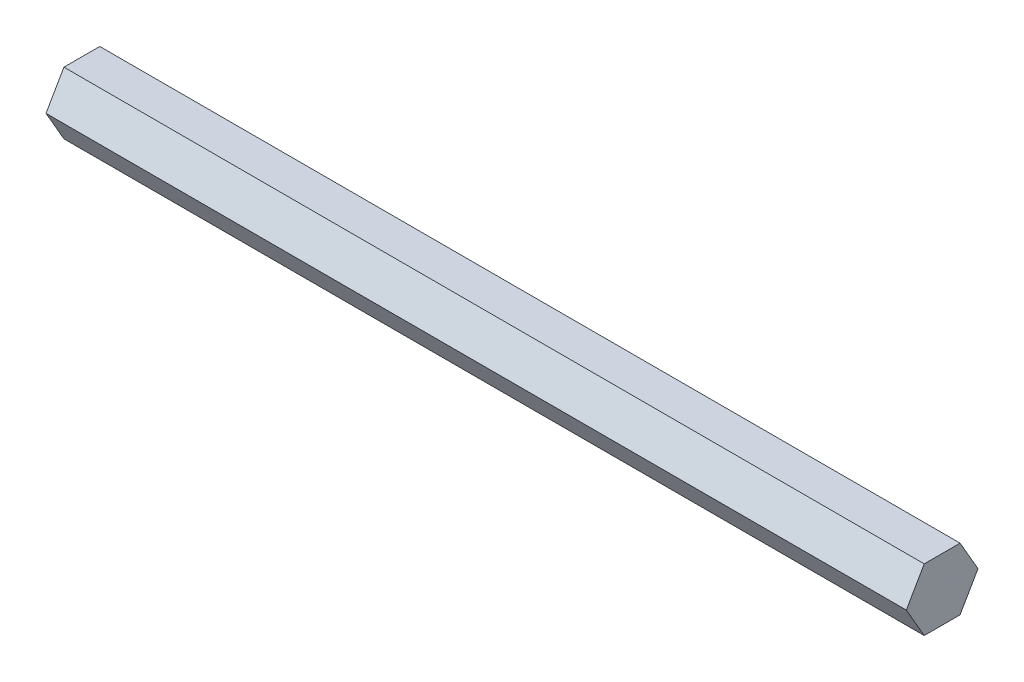
ISO-10303-21;
HEADER;
FILE_DESCRIPTION(('STEP AP214'),'2;1');
FILE_NAME('part.step','',(''),(''),'','','');
FILE_SCHEMA(('AUTOMOTIVE_DESIGN { 1 0 10303 214 1 1 1 1 }'));
ENDSEC;
DATA;
#1=APPLICATION_CONTEXT('core data for automotive mechanical design processes');
#2=APPLICATION_PROTOCOL_DEFINITION('international standard','automotive_design',2000,#1);
#3=PRODUCT_CONTEXT('',#1,'mechanical');
#4=PRODUCT('Part','Part','',(#3));
#5=PRODUCT_RELATED_PRODUCT_CATEGORY('part','',(#4));
#6=PRODUCT_DEFINITION_FORMATION('','',#4);
#7=PRODUCT_DEFINITION_CONTEXT('part definition',#1,'design');
#8=PRODUCT_DEFINITION('design','',#6,#7);
#9=PRODUCT_DEFINITION_SHAPE('','',#8);
#10=(LENGTH_UNIT() NAMED_UNIT(*) SI_UNIT(.MILLI.,.METRE.));
#11=(NAMED_UNIT(*) PLANE_ANGLE_UNIT() SI_UNIT($,.RADIAN.));
#12=(NAMED_UNIT(*) SI_UNIT($,.STERADIAN.) SOLID_ANGLE_UNIT());
#13=UNCERTAINTY_MEASURE_WITH_UNIT(LENGTH_MEASURE(1.E-05),#10,'distance_accuracy_value','');
#14=(GEOMETRIC_REPRESENTATION_CONTEXT(3) GLOBAL_UNCERTAINTY_ASSIGNED_CONTEXT((#13)) GLOBAL_UNIT_ASSIGNED_CONTEXT((#10,
#11,#12)) REPRESENTATION_CONTEXT('',''));
#15=CARTESIAN_POINT('',(0.,0.,0.));
#16=DIRECTION('',(0.,0.,1.));
#17=DIRECTION('',(1.,0.,0.));
#18=AXIS2_PLACEMENT_3D('',#15,#16,#17);
#19=CARTESIAN_POINT('',(114.3,-4.12444598552336,-2.38125000000005));
#20=DIRECTION('',(0.,0.499999999999995,0.866025403784442));
#21=DIRECTION('',(0.,-0.866025403784442,0.499999999999995));
#22=AXIS2_PLACEMENT_3D('',#19,#20,#21);
#23=PLANE('',#22);
#24=DIRECTION('',(0.,0.866025403784442,-0.499999999999995));
#25=VECTOR('',#24,1.);
#26=CARTESIAN_POINT('',(0.,-4.12444598552336,-2.38125000000005));
#27=LINE('',#26,#25);
#28=CARTESIAN_POINT('',(0.,-4.12444598552336,-2.38125000000005));
#29=VERTEX_POINT('',#28);
#30=CARTESIAN_POINT('',(0.,0.,-4.7625));
#31=VERTEX_POINT('',#30);
#32=EDGE_CURVE('E119',#29,#31,#27,.T.);
#33=ORIENTED_EDGE('',*,*,#32,.T.);
#34=DIRECTION('',(-1.,0.,0.));
#35=VECTOR('',#34,1.);
#36=CARTESIAN_POINT('',(114.3,0.,-4.7625));
#37=LINE('',#36,#35);
#38=CARTESIAN_POINT('',(114.3,0.,-4.7625));
#39=VERTEX_POINT('',#38);
#40=EDGE_CURVE('E11',#39,#31,#37,.T.);
#41=ORIENTED_EDGE('',*,*,#40,.F.);
#42=DIRECTION('',(0.,0.866025403784442,-0.499999999999995));
#43=VECTOR('',#42,1.);
#44=CARTESIAN_POINT('',(114.3,-4.12444598552336,-2.38125000000005));
#45=LINE('',#44,#43);
#46=CARTESIAN_POINT('',(114.3,-4.12444598552336,-2.38125000000005));
#47=VERTEX_POINT('',#46);
#48=EDGE_CURVE('E129',#47,#39,#45,.T.);
#49=ORIENTED_EDGE('',*,*,#48,.F.);
#50=DIRECTION('',(-1.,0.,0.));
#51=VECTOR('',#50,1.);
#52=CARTESIAN_POINT('',(114.3,-4.12444598552336,-2.38125000000005));
#53=LINE('',#52,#51);
#54=EDGE_CURVE('E115',#47,#29,#53,.T.);
#55=ORIENTED_EDGE('',*,*,#54,.T.);
#56=EDGE_LOOP('',(#33,#41,#49,#55));
#57=FACE_BOUND('',#56,.T.);
#58=ADVANCED_FACE('F35',(#57),#23,.F.);
#59=CARTESIAN_POINT('',(114.3,0.,-4.7625));
#60=DIRECTION('',(0.,-0.500000000000001,0.866025403784438));
#61=DIRECTION('',(0.,-0.866025403784438,-0.500000000000001));
#62=AXIS2_PLACEMENT_3D('',#59,#60,#61);
#63=PLANE('',#62);
#64=DIRECTION('',(0.,0.866025403784438,0.500000000000001));
#65=VECTOR('',#64,1.);
#66=CARTESIAN_POINT('',(0.,0.,-4.7625));
#67=LINE('',#66,#65);
#68=CARTESIAN_POINT('',(0.,4.1244459855234,-2.38124999999999));
#69=VERTEX_POINT('',#68);
#70=EDGE_CURVE('E122',#31,#69,#67,.T.);
#71=ORIENTED_EDGE('',*,*,#70,.T.);
#72=DIRECTION('',(-1.,0.,0.));
#73=VECTOR('',#72,1.);
#74=CARTESIAN_POINT('',(114.3,4.1244459855234,-2.38124999999999));
#75=LINE('',#74,#73);
#76=CARTESIAN_POINT('',(114.3,4.1244459855234,-2.38124999999999));
#77=VERTEX_POINT('',#76);
#78=EDGE_CURVE('E43',#77,#69,#75,.T.);
#79=ORIENTED_EDGE('',*,*,#78,.F.);
#80=DIRECTION('',(0.,0.866025403784438,0.500000000000001));
#81=VECTOR('',#80,1.);
#82=CARTESIAN_POINT('',(114.3,0.,-4.7625));
#83=LINE('',#82,#81);
#84=EDGE_CURVE('E88',#39,#77,#83,.T.);
#85=ORIENTED_EDGE('',*,*,#84,.F.);
#86=ORIENTED_EDGE('',*,*,#40,.T.);
#87=EDGE_LOOP('',(#71,#79,#85,#86));
#88=FACE_BOUND('',#87,.T.);
#89=ADVANCED_FACE('F153',(#88),#63,.F.);
#90=CARTESIAN_POINT('',(114.3,4.1244459855234,-2.38124999999999));
#91=DIRECTION('',(0.,-1.,0.));
#92=DIRECTION('',(0.,0.,-1.));
#93=AXIS2_PLACEMENT_3D('',#90,#91,#92);
#94=PLANE('',#93);
#95=DIRECTION('',(0.,0.,1.));
#96=VECTOR('',#95,1.);
#97=CARTESIAN_POINT('',(0.,4.1244459855234,-2.38124999999999));
#98=LINE('',#97,#96);
#99=CARTESIAN_POINT('',(0.,4.12444598552338,2.38125000000002));
#100=VERTEX_POINT('',#99);
#101=EDGE_CURVE('E124',#69,#100,#98,.T.);
#102=ORIENTED_EDGE('',*,*,#101,.T.);
#103=DIRECTION('',(-1.,0.,0.));
#104=VECTOR('',#103,1.);
#105=CARTESIAN_POINT('',(114.3,4.12444598552338,2.38125000000002));
#106=LINE('',#105,#104);
#107=CARTESIAN_POINT('',(114.3,4.12444598552338,2.38125000000002));
#108=VERTEX_POINT('',#107);
#109=EDGE_CURVE('E110',#108,#100,#106,.T.);
#110=ORIENTED_EDGE('',*,*,#109,.F.);
#111=DIRECTION('',(0.,0.,1.));
#112=VECTOR('',#111,1.);
#113=CARTESIAN_POINT('',(114.3,4.1244459855234,-2.38124999999999));
#114=LINE('',#113,#112);
#115=EDGE_CURVE('E101',#77,#108,#114,.T.);
#116=ORIENTED_EDGE('',*,*,#115,.F.);
#117=ORIENTED_EDGE('',*,*,#78,.T.);
#118=EDGE_LOOP('',(#102,#110,#116,#117));
#119=FACE_BOUND('',#118,.T.);
#120=ADVANCED_FACE('F135',(#119),#94,.F.);
#121=CARTESIAN_POINT('',(114.3,4.12444598552338,2.38125000000002));
#122=DIRECTION('',(0.,-0.499999999999995,-0.866025403784442));
#123=DIRECTION('',(0.,0.866025403784442,-0.499999999999995));
#124=AXIS2_PLACEMENT_3D('',#121,#122,#123);
#125=PLANE('',#124);
#126=DIRECTION('',(0.,-0.866025403784442,0.499999999999995));
#127=VECTOR('',#126,1.);
#128=CARTESIAN_POINT('',(0.,4.12444598552338,2.38125000000002));
#129=LINE('',#128,#127);
#130=CARTESIAN_POINT('',(0.,0.,4.7625));
#131=VERTEX_POINT('',#130);
#132=EDGE_CURVE('E109',#100,#131,#129,.T.);
#133=ORIENTED_EDGE('',*,*,#132,.T.);
#134=DIRECTION('',(-1.,0.,0.));
#135=VECTOR('',#134,1.);
#136=CARTESIAN_POINT('',(114.3,0.,4.7625));
#137=LINE('',#136,#135);
#138=CARTESIAN_POINT('',(114.3,0.,4.7625));
#139=VERTEX_POINT('',#138);
#140=EDGE_CURVE('E106',#139,#131,#137,.T.);
#141=ORIENTED_EDGE('',*,*,#140,.F.);
#142=DIRECTION('',(0.,-0.866025403784442,0.499999999999995));
#143=VECTOR('',#142,1.);
#144=CARTESIAN_POINT('',(114.3,4.12444598552338,2.38125000000002));
#145=LINE('',#144,#143);
#146=EDGE_CURVE('E95',#108,#139,#145,.T.);
#147=ORIENTED_EDGE('',*,*,#146,.F.);
#148=ORIENTED_EDGE('',*,*,#109,.T.);
#149=EDGE_LOOP('',(#133,#141,#147,#148));
#150=FACE_BOUND('',#149,.T.);
#151=ADVANCED_FACE('F107',(#150),#125,.F.);
#152=CARTESIAN_POINT('',(114.3,0.,4.7625));
#153=DIRECTION('',(0.,0.500000000000007,-0.866025403784435));
#154=DIRECTION('',(0.,0.866025403784435,0.500000000000007));
#155=AXIS2_PLACEMENT_3D('',#152,#153,#154);
#156=PLANE('',#155);
#157=DIRECTION('',(0.,-0.866025403784435,-0.500000000000007));
#158=VECTOR('',#157,1.);
#159=CARTESIAN_POINT('',(0.,0.,4.7625));
#160=LINE('',#159,#158);
#161=CARTESIAN_POINT('',(0.,-4.12444598552341,2.38124999999996));
#162=VERTEX_POINT('',#161);
#163=EDGE_CURVE('E74',#131,#162,#160,.T.);
#164=ORIENTED_EDGE('',*,*,#163,.T.);
#165=DIRECTION('',(-1.,0.,0.));
#166=VECTOR('',#165,1.);
#167=CARTESIAN_POINT('',(114.3,-4.12444598552341,2.38124999999996));
#168=LINE('',#167,#166);
#169=CARTESIAN_POINT('',(114.3,-4.12444598552341,2.38124999999996));
#170=VERTEX_POINT('',#169);
#171=EDGE_CURVE('E111',#170,#162,#168,.T.);
#172=ORIENTED_EDGE('',*,*,#171,.F.);
#173=DIRECTION('',(0.,-0.866025403784435,-0.500000000000007));
#174=VECTOR('',#173,1.);
#175=CARTESIAN_POINT('',(114.3,0.,4.7625));
#176=LINE('',#175,#174);
#177=EDGE_CURVE('E99',#139,#170,#176,.T.);
#178=ORIENTED_EDGE('',*,*,#177,.F.);
#179=ORIENTED_EDGE('',*,*,#140,.T.);
#180=EDGE_LOOP('',(#164,#172,#178,#179));
#181=FACE_BOUND('',#180,.T.);
#182=ADVANCED_FACE('F113',(#181),#156,.F.);
#183=CARTESIAN_POINT('',(114.3,-4.12444598552341,2.38124999999996));
#184=DIRECTION('',(0.,1.,0.));
#185=DIRECTION('',(0.,0.,1.));
#186=AXIS2_PLACEMENT_3D('',#183,#184,#185);
#187=PLANE('',#186);
#188=DIRECTION('',(0.,0.,-1.));
#189=VECTOR('',#188,1.);
#190=CARTESIAN_POINT('',(0.,-4.12444598552341,2.38124999999996));
#191=LINE('',#190,#189);
#192=EDGE_CURVE('E80',#162,#29,#191,.T.);
#193=ORIENTED_EDGE('',*,*,#192,.T.);
#194=ORIENTED_EDGE('',*,*,#54,.F.);
#195=DIRECTION('',(0.,0.,-1.));
#196=VECTOR('',#195,1.);
#197=CARTESIAN_POINT('',(114.3,-4.12444598552341,2.38124999999996));
#198=LINE('',#197,#196);
#199=EDGE_CURVE('E51',#170,#47,#198,.T.);
#200=ORIENTED_EDGE('',*,*,#199,.F.);
#201=ORIENTED_EDGE('',*,*,#171,.T.);
#202=EDGE_LOOP('',(#193,#194,#200,#201));
#203=FACE_BOUND('',#202,.T.);
#204=ADVANCED_FACE('F142',(#203),#187,.F.);
#205=CARTESIAN_POINT('',(114.3,0.,0.));
#206=DIRECTION('',(1.,0.,0.));
#207=DIRECTION('',(0.,0.,-1.));
#208=AXIS2_PLACEMENT_3D('',#205,#206,#207);
#209=PLANE('',#208);
#210=ORIENTED_EDGE('',*,*,#48,.T.);
#211=ORIENTED_EDGE('',*,*,#84,.T.);
#212=ORIENTED_EDGE('',*,*,#115,.T.);
#213=ORIENTED_EDGE('',*,*,#146,.T.);
#214=ORIENTED_EDGE('',*,*,#177,.T.);
#215=ORIENTED_EDGE('',*,*,#199,.T.);
#216=EDGE_LOOP('',(#210,#211,#212,#213,#214,#215));
#217=FACE_BOUND('',#216,.T.);
#218=ADVANCED_FACE('F97',(#217),#209,.T.);
#219=CARTESIAN_POINT('',(0.,0.,0.));
#220=DIRECTION('',(1.,0.,0.));
#221=DIRECTION('',(0.,0.,-1.));
#222=AXIS2_PLACEMENT_3D('',#219,#220,#221);
#223=PLANE('',#222);
#224=ORIENTED_EDGE('',*,*,#32,.F.);
#225=ORIENTED_EDGE('',*,*,#192,.F.);
#226=ORIENTED_EDGE('',*,*,#163,.F.);
#227=ORIENTED_EDGE('',*,*,#132,.F.);
#228=ORIENTED_EDGE('',*,*,#101,.F.);
#229=ORIENTED_EDGE('',*,*,#70,.F.);
#230=EDGE_LOOP('',(#224,#225,#226,#227,#228,#229));
#231=FACE_BOUND('',#230,.T.);
#232=ADVANCED_FACE('F138',(#231),#223,.F.);
#233=CLOSED_SHELL('',(#58,#89,#120,#151,#182,#204,#218,#232));
#234=MANIFOLD_SOLID_BREP('B2',#233);
#235=ADVANCED_BREP_SHAPE_REPRESENTATION('',(#18,#234),#14);
#236=SHAPE_DEFINITION_REPRESENTATION(#9,#235);
ENDSEC;
END-ISO-10303-21;
